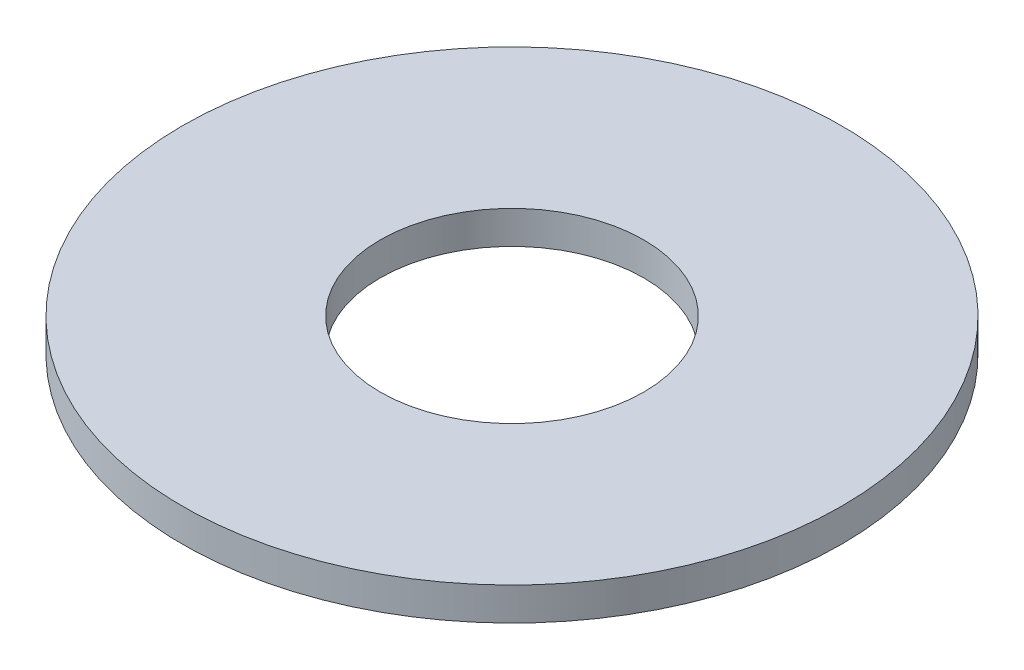
ISO-10303-21;
HEADER;
FILE_DESCRIPTION(('STEP AP214'),'2;1');
FILE_NAME('part.step','',(''),(''),'','','');
FILE_SCHEMA(('AUTOMOTIVE_DESIGN { 1 0 10303 214 1 1 1 1 }'));
ENDSEC;
DATA;
#1=APPLICATION_CONTEXT('core data for automotive mechanical design processes');
#2=APPLICATION_PROTOCOL_DEFINITION('international standard','automotive_design',2000,#1);
#3=PRODUCT_CONTEXT('',#1,'mechanical');
#4=PRODUCT('Part','Part','',(#3));
#5=PRODUCT_RELATED_PRODUCT_CATEGORY('part','',(#4));
#6=PRODUCT_DEFINITION_FORMATION('','',#4);
#7=PRODUCT_DEFINITION_CONTEXT('part definition',#1,'design');
#8=PRODUCT_DEFINITION('design','',#6,#7);
#9=PRODUCT_DEFINITION_SHAPE('','',#8);
#10=(LENGTH_UNIT() NAMED_UNIT(*) SI_UNIT(.MILLI.,.METRE.));
#11=(NAMED_UNIT(*) PLANE_ANGLE_UNIT() SI_UNIT($,.RADIAN.));
#12=(NAMED_UNIT(*) SI_UNIT($,.STERADIAN.) SOLID_ANGLE_UNIT());
#13=UNCERTAINTY_MEASURE_WITH_UNIT(LENGTH_MEASURE(1.E-05),#10,'distance_accuracy_value','');
#14=(GEOMETRIC_REPRESENTATION_CONTEXT(3) GLOBAL_UNCERTAINTY_ASSIGNED_CONTEXT((#13)) GLOBAL_UNIT_ASSIGNED_CONTEXT((#10,
#11,#12)) REPRESENTATION_CONTEXT('',''));
#15=CARTESIAN_POINT('',(0.,0.,0.));
#16=DIRECTION('',(0.,0.,1.));
#17=DIRECTION('',(1.,0.,0.));
#18=AXIS2_PLACEMENT_3D('',#15,#16,#17);
#19=CARTESIAN_POINT('',(2.54,0.1,0.));
#20=DIRECTION('',(0.,-1.,0.));
#21=DIRECTION('',(0.,0.,-1.));
#22=AXIS2_PLACEMENT_3D('',#19,#20,#21);
#23=CYLINDRICAL_SURFACE('',#22,0.4);
#24=CARTESIAN_POINT('',(2.54,0.1,0.));
#25=DIRECTION('',(0.,1.,0.));
#26=DIRECTION('',(1.,0.,0.));
#27=AXIS2_PLACEMENT_3D('',#24,#25,#26);
#28=CIRCLE('',#27,0.4);
#29=CARTESIAN_POINT('',(2.94,0.1,0.));
#30=VERTEX_POINT('',#29);
#31=EDGE_CURVE('E9',#30,#30,#28,.T.);
#32=ORIENTED_EDGE('',*,*,#31,.T.);
#33=EDGE_LOOP('',(#32));
#34=FACE_BOUND('',#33,.T.);
#35=CARTESIAN_POINT('',(2.54,0.,0.));
#36=DIRECTION('',(0.,-1.,0.));
#37=DIRECTION('',(0.,0.,-1.));
#38=AXIS2_PLACEMENT_3D('',#35,#36,#37);
#39=CIRCLE('',#38,0.4);
#40=CARTESIAN_POINT('',(2.54,0.,-0.4));
#41=VERTEX_POINT('',#40);
#42=EDGE_CURVE('E22',#41,#41,#39,.T.);
#43=ORIENTED_EDGE('',*,*,#42,.T.);
#44=EDGE_LOOP('',(#43));
#45=FACE_BOUND('',#44,.T.);
#46=ADVANCED_FACE('F14',(#34,#45),#23,.F.);
#47=CARTESIAN_POINT('',(2.54,0.1,0.));
#48=DIRECTION('',(0.,-1.,0.));
#49=DIRECTION('',(0.,0.,-1.));
#50=AXIS2_PLACEMENT_3D('',#47,#48,#49);
#51=CYLINDRICAL_SURFACE('',#50,1.);
#52=CARTESIAN_POINT('',(2.54,0.1,0.));
#53=DIRECTION('',(0.,1.,0.));
#54=DIRECTION('',(1.,0.,0.));
#55=AXIS2_PLACEMENT_3D('',#52,#53,#54);
#56=CIRCLE('',#55,1.);
#57=CARTESIAN_POINT('',(3.54,0.1,0.));
#58=VERTEX_POINT('',#57);
#59=EDGE_CURVE('E28',#58,#58,#56,.T.);
#60=ORIENTED_EDGE('',*,*,#59,.F.);
#61=EDGE_LOOP('',(#60));
#62=FACE_BOUND('',#61,.T.);
#63=CARTESIAN_POINT('',(2.54,0.,0.));
#64=DIRECTION('',(0.,1.,0.));
#65=DIRECTION('',(1.,0.,0.));
#66=AXIS2_PLACEMENT_3D('',#63,#64,#65);
#67=CIRCLE('',#66,1.);
#68=CARTESIAN_POINT('',(3.54,0.,0.));
#69=VERTEX_POINT('',#68);
#70=EDGE_CURVE('E18',#69,#69,#67,.T.);
#71=ORIENTED_EDGE('',*,*,#70,.T.);
#72=EDGE_LOOP('',(#71));
#73=FACE_BOUND('',#72,.T.);
#74=ADVANCED_FACE('F16',(#62,#73),#51,.T.);
#75=CARTESIAN_POINT('',(1.528,0.,-1.012));
#76=DIRECTION('',(0.,1.,0.));
#77=DIRECTION('',(0.,0.,1.));
#78=AXIS2_PLACEMENT_3D('',#75,#76,#77);
#79=PLANE('',#78);
#80=ORIENTED_EDGE('',*,*,#70,.F.);
#81=EDGE_LOOP('',(#80));
#82=FACE_BOUND('',#81,.T.);
#83=ORIENTED_EDGE('',*,*,#42,.F.);
#84=EDGE_LOOP('',(#83));
#85=FACE_BOUND('',#84,.T.);
#86=ADVANCED_FACE('F36',(#82,#85),#79,.F.);
#87=CARTESIAN_POINT('',(1.528,0.1,-1.012));
#88=DIRECTION('',(0.,1.,0.));
#89=DIRECTION('',(0.,0.,1.));
#90=AXIS2_PLACEMENT_3D('',#87,#88,#89);
#91=PLANE('',#90);
#92=ORIENTED_EDGE('',*,*,#59,.T.);
#93=EDGE_LOOP('',(#92));
#94=FACE_BOUND('',#93,.T.);
#95=ORIENTED_EDGE('',*,*,#31,.F.);
#96=EDGE_LOOP('',(#95));
#97=FACE_BOUND('',#96,.T.);
#98=ADVANCED_FACE('F39',(#94,#97),#91,.T.);
#99=CLOSED_SHELL('',(#46,#74,#86,#98));
#100=MANIFOLD_SOLID_BREP('B1',#99);
#101=ADVANCED_BREP_SHAPE_REPRESENTATION('',(#18,#100),#14);
#102=SHAPE_DEFINITION_REPRESENTATION(#9,#101);
ENDSEC;
END-ISO-10303-21;
